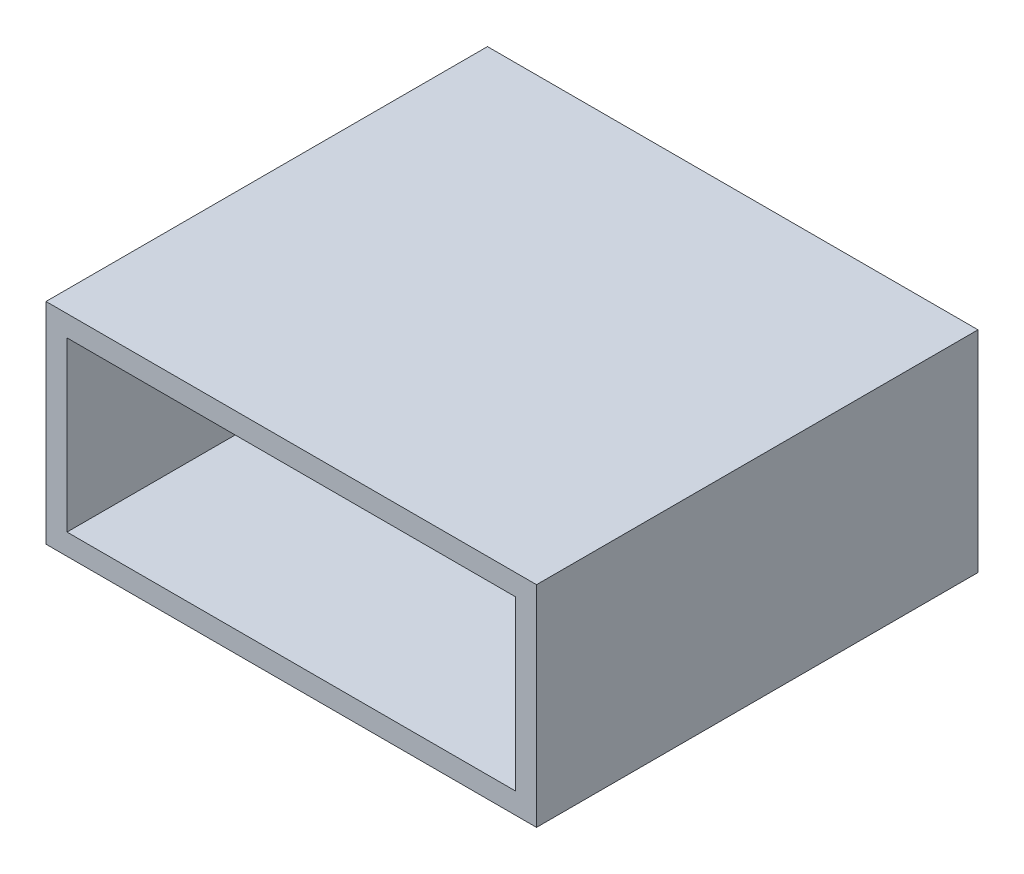
ISO-10303-21;
HEADER;
FILE_DESCRIPTION(('STEP AP214'),'2;1');
FILE_NAME('part.step','',(''),(''),'','','');
FILE_SCHEMA(('AUTOMOTIVE_DESIGN { 1 0 10303 214 1 1 1 1 }'));
ENDSEC;
DATA;
#1=APPLICATION_CONTEXT('core data for automotive mechanical design processes');
#2=APPLICATION_PROTOCOL_DEFINITION('international standard','automotive_design',2000,#1);
#3=PRODUCT_CONTEXT('',#1,'mechanical');
#4=PRODUCT('Part','Part','',(#3));
#5=PRODUCT_RELATED_PRODUCT_CATEGORY('part','',(#4));
#6=PRODUCT_DEFINITION_FORMATION('','',#4);
#7=PRODUCT_DEFINITION_CONTEXT('part definition',#1,'design');
#8=PRODUCT_DEFINITION('design','',#6,#7);
#9=PRODUCT_DEFINITION_SHAPE('','',#8);
#10=(LENGTH_UNIT() NAMED_UNIT(*) SI_UNIT(.MILLI.,.METRE.));
#11=(NAMED_UNIT(*) PLANE_ANGLE_UNIT() SI_UNIT($,.RADIAN.));
#12=(NAMED_UNIT(*) SI_UNIT($,.STERADIAN.) SOLID_ANGLE_UNIT());
#13=UNCERTAINTY_MEASURE_WITH_UNIT(LENGTH_MEASURE(1.E-05),#10,'distance_accuracy_value','');
#14=(GEOMETRIC_REPRESENTATION_CONTEXT(3) GLOBAL_UNCERTAINTY_ASSIGNED_CONTEXT((#13)) GLOBAL_UNIT_ASSIGNED_CONTEXT((#10,
#11,#12)) REPRESENTATION_CONTEXT('',''));
#15=CARTESIAN_POINT('',(0.,0.,0.));
#16=DIRECTION('',(0.,0.,1.));
#17=DIRECTION('',(1.,0.,0.));
#18=AXIS2_PLACEMENT_3D('',#15,#16,#17);
#19=CARTESIAN_POINT('',(0.,0.,60.));
#20=DIRECTION('',(0.,0.,-1.));
#21=DIRECTION('',(-1.,0.,0.));
#22=AXIS2_PLACEMENT_3D('',#19,#20,#21);
#23=PLANE('',#22);
#24=DIRECTION('',(0.,1.,0.));
#25=VECTOR('',#24,1.);
#26=CARTESIAN_POINT('',(35.,-15.,60.));
#27=LINE('',#26,#25);
#28=CARTESIAN_POINT('',(35.,-15.,60.));
#29=VERTEX_POINT('',#28);
#30=CARTESIAN_POINT('',(35.,15.,60.));
#31=VERTEX_POINT('',#30);
#32=EDGE_CURVE('E150',#29,#31,#27,.T.);
#33=ORIENTED_EDGE('',*,*,#32,.T.);
#34=DIRECTION('',(-1.,0.,0.));
#35=VECTOR('',#34,1.);
#36=CARTESIAN_POINT('',(-35.,15.,60.));
#37=LINE('',#36,#35);
#38=CARTESIAN_POINT('',(-35.,15.,60.));
#39=VERTEX_POINT('',#38);
#40=EDGE_CURVE('E104',#31,#39,#37,.T.);
#41=ORIENTED_EDGE('',*,*,#40,.T.);
#42=DIRECTION('',(0.,-1.,0.));
#43=VECTOR('',#42,1.);
#44=CARTESIAN_POINT('',(-35.,-15.,60.));
#45=LINE('',#44,#43);
#46=CARTESIAN_POINT('',(-35.,-15.,60.));
#47=VERTEX_POINT('',#46);
#48=EDGE_CURVE('E153',#39,#47,#45,.T.);
#49=ORIENTED_EDGE('',*,*,#48,.T.);
#50=DIRECTION('',(1.,0.,0.));
#51=VECTOR('',#50,1.);
#52=CARTESIAN_POINT('',(-35.,-15.,60.));
#53=LINE('',#52,#51);
#54=EDGE_CURVE('E155',#47,#29,#53,.T.);
#55=ORIENTED_EDGE('',*,*,#54,.T.);
#56=EDGE_LOOP('',(#33,#41,#49,#55));
#57=FACE_BOUND('',#56,.T.);
#58=DIRECTION('',(1.,0.,0.));
#59=VECTOR('',#58,1.);
#60=CARTESIAN_POINT('',(-32.,-12.,60.));
#61=LINE('',#60,#59);
#62=CARTESIAN_POINT('',(-32.,-12.,60.));
#63=VERTEX_POINT('',#62);
#64=CARTESIAN_POINT('',(32.,-12.,60.));
#65=VERTEX_POINT('',#64);
#66=EDGE_CURVE('E125',#63,#65,#61,.T.);
#67=ORIENTED_EDGE('',*,*,#66,.F.);
#68=DIRECTION('',(0.,-1.,0.));
#69=VECTOR('',#68,1.);
#70=CARTESIAN_POINT('',(-32.,-12.,60.));
#71=LINE('',#70,#69);
#72=CARTESIAN_POINT('',(-32.,12.,60.));
#73=VERTEX_POINT('',#72);
#74=EDGE_CURVE('E132',#73,#63,#71,.T.);
#75=ORIENTED_EDGE('',*,*,#74,.F.);
#76=DIRECTION('',(-1.,0.,0.));
#77=VECTOR('',#76,1.);
#78=CARTESIAN_POINT('',(-32.,12.,60.));
#79=LINE('',#78,#77);
#80=CARTESIAN_POINT('',(32.,12.,60.));
#81=VERTEX_POINT('',#80);
#82=EDGE_CURVE('E130',#81,#73,#79,.T.);
#83=ORIENTED_EDGE('',*,*,#82,.F.);
#84=DIRECTION('',(0.,1.,0.));
#85=VECTOR('',#84,1.);
#86=CARTESIAN_POINT('',(32.,-12.,60.));
#87=LINE('',#86,#85);
#88=EDGE_CURVE('E127',#65,#81,#87,.T.);
#89=ORIENTED_EDGE('',*,*,#88,.F.);
#90=EDGE_LOOP('',(#67,#75,#83,#89));
#91=FACE_BOUND('',#90,.T.);
#92=ADVANCED_FACE('F33',(#57,#91),#23,.F.);
#93=CARTESIAN_POINT('',(35.,-15.,60.));
#94=DIRECTION('',(-1.,0.,0.));
#95=DIRECTION('',(0.,0.,1.));
#96=AXIS2_PLACEMENT_3D('',#93,#94,#95);
#97=PLANE('',#96);
#98=DIRECTION('',(0.,0.,-1.));
#99=VECTOR('',#98,1.);
#100=CARTESIAN_POINT('',(35.,-15.,60.));
#101=LINE('',#100,#99);
#102=CARTESIAN_POINT('',(35.,-15.,-3.));
#103=VERTEX_POINT('',#102);
#104=EDGE_CURVE('E111',#29,#103,#101,.T.);
#105=ORIENTED_EDGE('',*,*,#104,.T.);
#106=DIRECTION('',(0.,-1.,0.));
#107=VECTOR('',#106,1.);
#108=CARTESIAN_POINT('',(35.,15.,-3.));
#109=LINE('',#108,#107);
#110=CARTESIAN_POINT('',(35.,15.,-3.));
#111=VERTEX_POINT('',#110);
#112=EDGE_CURVE('E109',#111,#103,#109,.T.);
#113=ORIENTED_EDGE('',*,*,#112,.F.);
#114=DIRECTION('',(0.,0.,-1.));
#115=VECTOR('',#114,1.);
#116=CARTESIAN_POINT('',(35.,15.,60.));
#117=LINE('',#116,#115);
#118=EDGE_CURVE('E11',#31,#111,#117,.T.);
#119=ORIENTED_EDGE('',*,*,#118,.F.);
#120=ORIENTED_EDGE('',*,*,#32,.F.);
#121=EDGE_LOOP('',(#105,#113,#119,#120));
#122=FACE_BOUND('',#121,.T.);
#123=ADVANCED_FACE('F35',(#122),#97,.F.);
#124=CARTESIAN_POINT('',(-35.,15.,60.));
#125=DIRECTION('',(0.,-1.,0.));
#126=DIRECTION('',(0.,0.,-1.));
#127=AXIS2_PLACEMENT_3D('',#124,#125,#126);
#128=PLANE('',#127);
#129=ORIENTED_EDGE('',*,*,#118,.T.);
#130=DIRECTION('',(1.,0.,0.));
#131=VECTOR('',#130,1.);
#132=CARTESIAN_POINT('',(-35.,15.,-3.));
#133=LINE('',#132,#131);
#134=CARTESIAN_POINT('',(-35.,15.,-3.));
#135=VERTEX_POINT('',#134);
#136=EDGE_CURVE('E103',#135,#111,#133,.T.);
#137=ORIENTED_EDGE('',*,*,#136,.F.);
#138=DIRECTION('',(0.,0.,-1.));
#139=VECTOR('',#138,1.);
#140=CARTESIAN_POINT('',(-35.,15.,60.));
#141=LINE('',#140,#139);
#142=EDGE_CURVE('E41',#39,#135,#141,.T.);
#143=ORIENTED_EDGE('',*,*,#142,.F.);
#144=ORIENTED_EDGE('',*,*,#40,.F.);
#145=EDGE_LOOP('',(#129,#137,#143,#144));
#146=FACE_BOUND('',#145,.T.);
#147=ADVANCED_FACE('F100',(#146),#128,.F.);
#148=CARTESIAN_POINT('',(-35.,-15.,60.));
#149=DIRECTION('',(1.,0.,0.));
#150=DIRECTION('',(0.,0.,-1.));
#151=AXIS2_PLACEMENT_3D('',#148,#149,#150);
#152=PLANE('',#151);
#153=ORIENTED_EDGE('',*,*,#142,.T.);
#154=DIRECTION('',(0.,1.,0.));
#155=VECTOR('',#154,1.);
#156=CARTESIAN_POINT('',(-35.,-15.,-3.));
#157=LINE('',#156,#155);
#158=CARTESIAN_POINT('',(-35.,-15.,-3.));
#159=VERTEX_POINT('',#158);
#160=EDGE_CURVE('E120',#159,#135,#157,.T.);
#161=ORIENTED_EDGE('',*,*,#160,.F.);
#162=DIRECTION('',(0.,0.,-1.));
#163=VECTOR('',#162,1.);
#164=CARTESIAN_POINT('',(-35.,-15.,60.));
#165=LINE('',#164,#163);
#166=EDGE_CURVE('E158',#47,#159,#165,.T.);
#167=ORIENTED_EDGE('',*,*,#166,.F.);
#168=ORIENTED_EDGE('',*,*,#48,.F.);
#169=EDGE_LOOP('',(#153,#161,#167,#168));
#170=FACE_BOUND('',#169,.T.);
#171=ADVANCED_FACE('F161',(#170),#152,.F.);
#172=CARTESIAN_POINT('',(-35.,-15.,60.));
#173=DIRECTION('',(0.,1.,0.));
#174=DIRECTION('',(0.,0.,1.));
#175=AXIS2_PLACEMENT_3D('',#172,#173,#174);
#176=PLANE('',#175);
#177=ORIENTED_EDGE('',*,*,#166,.T.);
#178=DIRECTION('',(-1.,0.,0.));
#179=VECTOR('',#178,1.);
#180=CARTESIAN_POINT('',(35.,-15.,-3.));
#181=LINE('',#180,#179);
#182=EDGE_CURVE('E115',#103,#159,#181,.T.);
#183=ORIENTED_EDGE('',*,*,#182,.F.);
#184=ORIENTED_EDGE('',*,*,#104,.F.);
#185=ORIENTED_EDGE('',*,*,#54,.F.);
#186=EDGE_LOOP('',(#177,#183,#184,#185));
#187=FACE_BOUND('',#186,.T.);
#188=ADVANCED_FACE('F167',(#187),#176,.F.);
#189=CARTESIAN_POINT('',(-32.,-12.,60.));
#190=DIRECTION('',(0.,1.,0.));
#191=DIRECTION('',(0.,0.,1.));
#192=AXIS2_PLACEMENT_3D('',#189,#190,#191);
#193=PLANE('',#192);
#194=DIRECTION('',(1.,0.,0.));
#195=VECTOR('',#194,1.);
#196=CARTESIAN_POINT('',(-32.,-12.,0.));
#197=LINE('',#196,#195);
#198=CARTESIAN_POINT('',(-32.,-12.,0.));
#199=VERTEX_POINT('',#198);
#200=CARTESIAN_POINT('',(32.,-12.,0.));
#201=VERTEX_POINT('',#200);
#202=EDGE_CURVE('E56',#199,#201,#197,.T.);
#203=ORIENTED_EDGE('',*,*,#202,.F.);
#204=DIRECTION('',(0.,0.,-1.));
#205=VECTOR('',#204,1.);
#206=CARTESIAN_POINT('',(-32.,-12.,60.));
#207=LINE('',#206,#205);
#208=EDGE_CURVE('E134',#63,#199,#207,.T.);
#209=ORIENTED_EDGE('',*,*,#208,.F.);
#210=ORIENTED_EDGE('',*,*,#66,.T.);
#211=DIRECTION('',(0.,0.,-1.));
#212=VECTOR('',#211,1.);
#213=CARTESIAN_POINT('',(32.,-12.,60.));
#214=LINE('',#213,#212);
#215=EDGE_CURVE('E148',#65,#201,#214,.T.);
#216=ORIENTED_EDGE('',*,*,#215,.T.);
#217=EDGE_LOOP('',(#203,#209,#210,#216));
#218=FACE_BOUND('',#217,.T.);
#219=ADVANCED_FACE('F169',(#218),#193,.T.);
#220=CARTESIAN_POINT('',(32.,-12.,60.));
#221=DIRECTION('',(-1.,0.,0.));
#222=DIRECTION('',(0.,0.,1.));
#223=AXIS2_PLACEMENT_3D('',#220,#221,#222);
#224=PLANE('',#223);
#225=DIRECTION('',(0.,1.,0.));
#226=VECTOR('',#225,1.);
#227=CARTESIAN_POINT('',(32.,-12.,0.));
#228=LINE('',#227,#226);
#229=CARTESIAN_POINT('',(32.,12.,0.));
#230=VERTEX_POINT('',#229);
#231=EDGE_CURVE('E136',#201,#230,#228,.T.);
#232=ORIENTED_EDGE('',*,*,#231,.F.);
#233=ORIENTED_EDGE('',*,*,#215,.F.);
#234=ORIENTED_EDGE('',*,*,#88,.T.);
#235=DIRECTION('',(0.,0.,-1.));
#236=VECTOR('',#235,1.);
#237=CARTESIAN_POINT('',(32.,12.,60.));
#238=LINE('',#237,#236);
#239=EDGE_CURVE('E146',#81,#230,#238,.T.);
#240=ORIENTED_EDGE('',*,*,#239,.T.);
#241=EDGE_LOOP('',(#232,#233,#234,#240));
#242=FACE_BOUND('',#241,.T.);
#243=ADVANCED_FACE('F175',(#242),#224,.T.);
#244=CARTESIAN_POINT('',(-32.,12.,60.));
#245=DIRECTION('',(0.,-1.,0.));
#246=DIRECTION('',(1.,0.,0.));
#247=AXIS2_PLACEMENT_3D('',#244,#245,#246);
#248=PLANE('',#247);
#249=DIRECTION('',(-1.,0.,0.));
#250=VECTOR('',#249,1.);
#251=CARTESIAN_POINT('',(-32.,12.,0.));
#252=LINE('',#251,#250);
#253=CARTESIAN_POINT('',(-32.,12.,0.));
#254=VERTEX_POINT('',#253);
#255=EDGE_CURVE('E139',#230,#254,#252,.T.);
#256=ORIENTED_EDGE('',*,*,#255,.F.);
#257=ORIENTED_EDGE('',*,*,#239,.F.);
#258=ORIENTED_EDGE('',*,*,#82,.T.);
#259=DIRECTION('',(0.,0.,-1.));
#260=VECTOR('',#259,1.);
#261=CARTESIAN_POINT('',(-32.,12.,60.));
#262=LINE('',#261,#260);
#263=EDGE_CURVE('E48',#73,#254,#262,.T.);
#264=ORIENTED_EDGE('',*,*,#263,.T.);
#265=EDGE_LOOP('',(#256,#257,#258,#264));
#266=FACE_BOUND('',#265,.T.);
#267=ADVANCED_FACE('F186',(#266),#248,.T.);
#268=CARTESIAN_POINT('',(-32.,-12.,60.));
#269=DIRECTION('',(1.,0.,0.));
#270=DIRECTION('',(0.,0.,-1.));
#271=AXIS2_PLACEMENT_3D('',#268,#269,#270);
#272=PLANE('',#271);
#273=DIRECTION('',(0.,-1.,0.));
#274=VECTOR('',#273,1.);
#275=CARTESIAN_POINT('',(-32.,-12.,0.));
#276=LINE('',#275,#274);
#277=EDGE_CURVE('E128',#254,#199,#276,.T.);
#278=ORIENTED_EDGE('',*,*,#277,.F.);
#279=ORIENTED_EDGE('',*,*,#263,.F.);
#280=ORIENTED_EDGE('',*,*,#74,.T.);
#281=ORIENTED_EDGE('',*,*,#208,.T.);
#282=EDGE_LOOP('',(#278,#279,#280,#281));
#283=FACE_BOUND('',#282,.T.);
#284=ADVANCED_FACE('F190',(#283),#272,.T.);
#285=CARTESIAN_POINT('',(0.,0.,0.));
#286=DIRECTION('',(0.,0.,-1.));
#287=DIRECTION('',(-1.,0.,0.));
#288=AXIS2_PLACEMENT_3D('',#285,#286,#287);
#289=PLANE('',#288);
#290=ORIENTED_EDGE('',*,*,#255,.T.);
#291=ORIENTED_EDGE('',*,*,#277,.T.);
#292=ORIENTED_EDGE('',*,*,#202,.T.);
#293=ORIENTED_EDGE('',*,*,#231,.T.);
#294=EDGE_LOOP('',(#290,#291,#292,#293));
#295=FACE_BOUND('',#294,.T.);
#296=ADVANCED_FACE('F194',(#295),#289,.F.);
#297=CARTESIAN_POINT('',(0.,0.,-3.));
#298=DIRECTION('',(0.,0.,-1.));
#299=DIRECTION('',(-1.,0.,0.));
#300=AXIS2_PLACEMENT_3D('',#297,#298,#299);
#301=PLANE('',#300);
#302=ORIENTED_EDGE('',*,*,#136,.T.);
#303=ORIENTED_EDGE('',*,*,#112,.T.);
#304=ORIENTED_EDGE('',*,*,#182,.T.);
#305=ORIENTED_EDGE('',*,*,#160,.T.);
#306=EDGE_LOOP('',(#302,#303,#304,#305));
#307=FACE_BOUND('',#306,.T.);
#308=ADVANCED_FACE('F118',(#307),#301,.T.);
#309=CLOSED_SHELL('',(#92,#123,#147,#171,#188,#219,#243,#267,#284,#296,#308));
#310=MANIFOLD_SOLID_BREP('B2',#309);
#311=ADVANCED_BREP_SHAPE_REPRESENTATION('',(#18,#310),#14);
#312=SHAPE_DEFINITION_REPRESENTATION(#9,#311);
ENDSEC;
END-ISO-10303-21;
